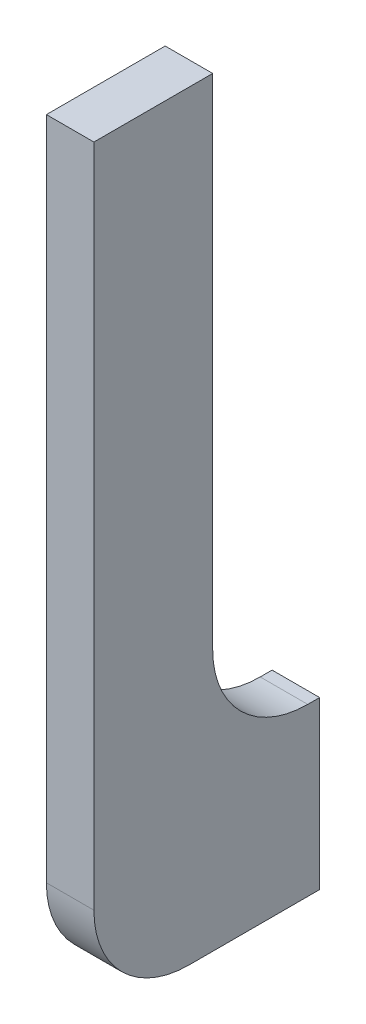
ISO-10303-21;
HEADER;
FILE_DESCRIPTION(('STEP AP214'),'2;1');
FILE_NAME('part.step','',(''),(''),'','','');
FILE_SCHEMA(('AUTOMOTIVE_DESIGN { 1 0 10303 214 1 1 1 1 }'));
ENDSEC;
DATA;
#1=APPLICATION_CONTEXT('core data for automotive mechanical design processes');
#2=APPLICATION_PROTOCOL_DEFINITION('international standard','automotive_design',2000,#1);
#3=PRODUCT_CONTEXT('',#1,'mechanical');
#4=PRODUCT('Part','Part','',(#3));
#5=PRODUCT_RELATED_PRODUCT_CATEGORY('part','',(#4));
#6=PRODUCT_DEFINITION_FORMATION('','',#4);
#7=PRODUCT_DEFINITION_CONTEXT('part definition',#1,'design');
#8=PRODUCT_DEFINITION('design','',#6,#7);
#9=PRODUCT_DEFINITION_SHAPE('','',#8);
#10=(LENGTH_UNIT() NAMED_UNIT(*) SI_UNIT(.MILLI.,.METRE.));
#11=(NAMED_UNIT(*) PLANE_ANGLE_UNIT() SI_UNIT($,.RADIAN.));
#12=(NAMED_UNIT(*) SI_UNIT($,.STERADIAN.) SOLID_ANGLE_UNIT());
#13=UNCERTAINTY_MEASURE_WITH_UNIT(LENGTH_MEASURE(1.E-05),#10,'distance_accuracy_value','');
#14=(GEOMETRIC_REPRESENTATION_CONTEXT(3) GLOBAL_UNCERTAINTY_ASSIGNED_CONTEXT((#13)) GLOBAL_UNIT_ASSIGNED_CONTEXT((#10,
#11,#12)) REPRESENTATION_CONTEXT('',''));
#15=CARTESIAN_POINT('',(0.,0.,0.));
#16=DIRECTION('',(0.,0.,1.));
#17=DIRECTION('',(1.,0.,0.));
#18=AXIS2_PLACEMENT_3D('',#15,#16,#17);
#19=CARTESIAN_POINT('',(0.,0.,0.));
#20=DIRECTION('',(0.,0.,1.));
#21=DIRECTION('',(1.,0.,0.));
#22=AXIS2_PLACEMENT_3D('',#19,#20,#21);
#23=PLANE('',#22);
#24=DIRECTION('',(0.,1.,0.));
#25=VECTOR('',#24,1.);
#26=CARTESIAN_POINT('',(2.,15.,0.));
#27=LINE('',#26,#25);
#28=CARTESIAN_POINT('',(2.00000000000001,-5.99802755198724,0.));
#29=VERTEX_POINT('',#28);
#30=CARTESIAN_POINT('',(2.,15.,0.));
#31=VERTEX_POINT('',#30);
#32=EDGE_CURVE('E148',#29,#31,#27,.T.);
#33=ORIENTED_EDGE('',*,*,#32,.F.);
#34=DIRECTION('',(1.,0.,0.));
#35=VECTOR('',#34,1.);
#36=CARTESIAN_POINT('',(0.,-5.99802755198725,0.));
#37=LINE('',#36,#35);
#38=CARTESIAN_POINT('',(0.,-5.99802755198725,0.));
#39=VERTEX_POINT('',#38);
#40=EDGE_CURVE('E63',#29,#39,#37,.F.);
#41=ORIENTED_EDGE('',*,*,#40,.T.);
#42=DIRECTION('',(0.,-1.,0.));
#43=VECTOR('',#42,1.);
#44=CARTESIAN_POINT('',(0.,0.,0.));
#45=LINE('',#44,#43);
#46=CARTESIAN_POINT('',(0.,15.,0.));
#47=VERTEX_POINT('',#46);
#48=EDGE_CURVE('E154',#47,#39,#45,.T.);
#49=ORIENTED_EDGE('',*,*,#48,.F.);
#50=DIRECTION('',(-1.,0.,0.));
#51=VECTOR('',#50,1.);
#52=CARTESIAN_POINT('',(0.,15.,0.));
#53=LINE('',#52,#51);
#54=EDGE_CURVE('E164',#31,#47,#53,.T.);
#55=ORIENTED_EDGE('',*,*,#54,.F.);
#56=EDGE_LOOP('',(#33,#41,#49,#55));
#57=FACE_BOUND('',#56,.T.);
#58=ADVANCED_FACE('F41',(#57),#23,.F.);
#59=CARTESIAN_POINT('',(0.,-17.,5.));
#60=DIRECTION('',(0.,1.,0.));
#61=DIRECTION('',(0.,0.,1.));
#62=AXIS2_PLACEMENT_3D('',#59,#60,#61);
#63=PLANE('',#62);
#64=DIRECTION('',(0.,0.,-1.));
#65=VECTOR('',#64,1.);
#66=CARTESIAN_POINT('',(2.,-17.,5.));
#67=LINE('',#66,#65);
#68=CARTESIAN_POINT('',(2.,-17.,1.));
#69=VERTEX_POINT('',#68);
#70=CARTESIAN_POINT('',(2.,-17.,-4.5));
#71=VERTEX_POINT('',#70);
#72=EDGE_CURVE('E108',#69,#71,#67,.T.);
#73=ORIENTED_EDGE('',*,*,#72,.F.);
#74=DIRECTION('',(1.,0.,0.));
#75=VECTOR('',#74,1.);
#76=CARTESIAN_POINT('',(0.,-17.,1.));
#77=LINE('',#76,#75);
#78=CARTESIAN_POINT('',(0.,-17.,1.));
#79=VERTEX_POINT('',#78);
#80=EDGE_CURVE('E183',#69,#79,#77,.F.);
#81=ORIENTED_EDGE('',*,*,#80,.T.);
#82=DIRECTION('',(0.,0.,-1.));
#83=VECTOR('',#82,1.);
#84=CARTESIAN_POINT('',(0.,-17.,5.));
#85=LINE('',#84,#83);
#86=CARTESIAN_POINT('',(0.,-17.,-4.5));
#87=VERTEX_POINT('',#86);
#88=EDGE_CURVE('E119',#79,#87,#85,.T.);
#89=ORIENTED_EDGE('',*,*,#88,.T.);
#90=DIRECTION('',(-1.,0.,0.));
#91=VECTOR('',#90,1.);
#92=CARTESIAN_POINT('',(2.,-17.,-4.5));
#93=LINE('',#92,#91);
#94=EDGE_CURVE('E123',#71,#87,#93,.T.);
#95=ORIENTED_EDGE('',*,*,#94,.F.);
#96=EDGE_LOOP('',(#73,#81,#89,#95));
#97=FACE_BOUND('',#96,.T.);
#98=ADVANCED_FACE('F124',(#97),#63,.F.);
#99=CARTESIAN_POINT('',(2.,15.,5.));
#100=DIRECTION('',(-1.,0.,0.));
#101=DIRECTION('',(0.,-1.,0.));
#102=AXIS2_PLACEMENT_3D('',#99,#100,#101);
#103=PLANE('',#102);
#104=DIRECTION('',(0.,1.,0.));
#105=VECTOR('',#104,1.);
#106=CARTESIAN_POINT('',(2.,-17.,5.));
#107=LINE('',#106,#105);
#108=CARTESIAN_POINT('',(2.,-13.,5.));
#109=VERTEX_POINT('',#108);
#110=CARTESIAN_POINT('',(2.,15.,5.));
#111=VERTEX_POINT('',#110);
#112=EDGE_CURVE('E153',#109,#111,#107,.T.);
#113=ORIENTED_EDGE('',*,*,#112,.F.);
#114=CARTESIAN_POINT('',(2.00000000000001,-13.,1.));
#115=DIRECTION('',(-1.,0.,0.));
#116=DIRECTION('',(0.,-1.,0.));
#117=AXIS2_PLACEMENT_3D('',#114,#115,#116);
#118=CIRCLE('',#117,4.);
#119=EDGE_CURVE('E115',#109,#69,#118,.F.);
#120=ORIENTED_EDGE('',*,*,#119,.T.);
#121=ORIENTED_EDGE('',*,*,#72,.T.);
#122=DIRECTION('',(0.,-1.,0.));
#123=VECTOR('',#122,1.);
#124=CARTESIAN_POINT('',(2.,-9.99802755198725,-4.5));
#125=LINE('',#124,#123);
#126=CARTESIAN_POINT('',(2.,-9.99802755198725,-4.5));
#127=VERTEX_POINT('',#126);
#128=EDGE_CURVE('E114',#127,#71,#125,.T.);
#129=ORIENTED_EDGE('',*,*,#128,.F.);
#130=DIRECTION('',(0.,0.,1.));
#131=VECTOR('',#130,1.);
#132=CARTESIAN_POINT('',(2.,-9.99802755198725,-4.5));
#133=LINE('',#132,#131);
#134=CARTESIAN_POINT('',(2.,-9.99802755198725,-4.));
#135=VERTEX_POINT('',#134);
#136=EDGE_CURVE('E142',#127,#135,#133,.T.);
#137=ORIENTED_EDGE('',*,*,#136,.T.);
#138=CARTESIAN_POINT('',(2.00000000000001,-5.99802755198725,-4.));
#139=DIRECTION('',(-1.,0.,0.));
#140=DIRECTION('',(0.,-1.,0.));
#141=AXIS2_PLACEMENT_3D('',#138,#139,#140);
#142=CIRCLE('',#141,4.);
#143=EDGE_CURVE('E50',#135,#29,#142,.T.);
#144=ORIENTED_EDGE('',*,*,#143,.T.);
#145=ORIENTED_EDGE('',*,*,#32,.T.);
#146=DIRECTION('',(0.,0.,-1.));
#147=VECTOR('',#146,1.);
#148=CARTESIAN_POINT('',(2.,15.,5.));
#149=LINE('',#148,#147);
#150=EDGE_CURVE('E120',#111,#31,#149,.T.);
#151=ORIENTED_EDGE('',*,*,#150,.F.);
#152=EDGE_LOOP('',(#113,#120,#121,#129,#137,#144,#145,#151));
#153=FACE_BOUND('',#152,.T.);
#154=ADVANCED_FACE('F111',(#153),#103,.F.);
#155=CARTESIAN_POINT('',(0.,15.,5.));
#156=DIRECTION('',(0.,-1.,0.));
#157=DIRECTION('',(0.,0.,-1.));
#158=AXIS2_PLACEMENT_3D('',#155,#156,#157);
#159=PLANE('',#158);
#160=ORIENTED_EDGE('',*,*,#54,.T.);
#161=DIRECTION('',(0.,0.,-1.));
#162=VECTOR('',#161,1.);
#163=CARTESIAN_POINT('',(0.,15.,5.));
#164=LINE('',#163,#162);
#165=CARTESIAN_POINT('',(0.,15.,5.));
#166=VERTEX_POINT('',#165);
#167=EDGE_CURVE('E161',#166,#47,#164,.T.);
#168=ORIENTED_EDGE('',*,*,#167,.F.);
#169=DIRECTION('',(-1.,0.,0.));
#170=VECTOR('',#169,1.);
#171=CARTESIAN_POINT('',(0.,15.,5.));
#172=LINE('',#171,#170);
#173=EDGE_CURVE('E157',#111,#166,#172,.T.);
#174=ORIENTED_EDGE('',*,*,#173,.F.);
#175=ORIENTED_EDGE('',*,*,#150,.T.);
#176=EDGE_LOOP('',(#160,#168,#174,#175));
#177=FACE_BOUND('',#176,.T.);
#178=ADVANCED_FACE('F211',(#177),#159,.F.);
#179=CARTESIAN_POINT('',(0.,0.,5.));
#180=DIRECTION('',(1.,0.,0.));
#181=DIRECTION('',(0.,0.,-1.));
#182=AXIS2_PLACEMENT_3D('',#179,#180,#181);
#183=PLANE('',#182);
#184=ORIENTED_EDGE('',*,*,#88,.F.);
#185=CARTESIAN_POINT('',(0.,-13.,1.));
#186=DIRECTION('',(1.,0.,0.));
#187=DIRECTION('',(0.,0.,-1.));
#188=AXIS2_PLACEMENT_3D('',#185,#186,#187);
#189=CIRCLE('',#188,4.);
#190=CARTESIAN_POINT('',(0.,-13.,5.));
#191=VERTEX_POINT('',#190);
#192=EDGE_CURVE('E186',#79,#191,#189,.F.);
#193=ORIENTED_EDGE('',*,*,#192,.T.);
#194=DIRECTION('',(0.,-1.,0.));
#195=VECTOR('',#194,1.);
#196=CARTESIAN_POINT('',(0.,0.,5.));
#197=LINE('',#196,#195);
#198=EDGE_CURVE('E149',#166,#191,#197,.T.);
#199=ORIENTED_EDGE('',*,*,#198,.F.);
#200=ORIENTED_EDGE('',*,*,#167,.T.);
#201=ORIENTED_EDGE('',*,*,#48,.T.);
#202=CARTESIAN_POINT('',(0.,-5.99802755198725,-4.));
#203=DIRECTION('',(1.,0.,0.));
#204=DIRECTION('',(0.,0.,-1.));
#205=AXIS2_PLACEMENT_3D('',#202,#203,#204);
#206=CIRCLE('',#205,4.);
#207=CARTESIAN_POINT('',(0.,-9.99802755198725,-4.));
#208=VERTEX_POINT('',#207);
#209=EDGE_CURVE('E11',#39,#208,#206,.T.);
#210=ORIENTED_EDGE('',*,*,#209,.T.);
#211=DIRECTION('',(0.,0.,1.));
#212=VECTOR('',#211,1.);
#213=CARTESIAN_POINT('',(0.,-9.99802755198725,-4.5));
#214=LINE('',#213,#212);
#215=CARTESIAN_POINT('',(0.,-9.99802755198725,-4.5));
#216=VERTEX_POINT('',#215);
#217=EDGE_CURVE('E145',#216,#208,#214,.T.);
#218=ORIENTED_EDGE('',*,*,#217,.F.);
#219=DIRECTION('',(0.,1.,0.));
#220=VECTOR('',#219,1.);
#221=CARTESIAN_POINT('',(0.,-17.,-4.5));
#222=LINE('',#221,#220);
#223=EDGE_CURVE('E129',#87,#216,#222,.T.);
#224=ORIENTED_EDGE('',*,*,#223,.F.);
#225=EDGE_LOOP('',(#184,#193,#199,#200,#201,#210,#218,#224));
#226=FACE_BOUND('',#225,.T.);
#227=ADVANCED_FACE('F201',(#226),#183,.F.);
#228=CARTESIAN_POINT('',(0.,0.,5.));
#229=DIRECTION('',(0.,0.,1.));
#230=DIRECTION('',(1.,0.,0.));
#231=AXIS2_PLACEMENT_3D('',#228,#229,#230);
#232=PLANE('',#231);
#233=ORIENTED_EDGE('',*,*,#198,.T.);
#234=DIRECTION('',(1.,0.,0.));
#235=VECTOR('',#234,1.);
#236=CARTESIAN_POINT('',(2.,-13.,5.));
#237=LINE('',#236,#235);
#238=EDGE_CURVE('E177',#191,#109,#237,.T.);
#239=ORIENTED_EDGE('',*,*,#238,.T.);
#240=ORIENTED_EDGE('',*,*,#112,.T.);
#241=ORIENTED_EDGE('',*,*,#173,.T.);
#242=EDGE_LOOP('',(#233,#239,#240,#241));
#243=FACE_BOUND('',#242,.T.);
#244=ADVANCED_FACE('F207',(#243),#232,.T.);
#245=CARTESIAN_POINT('',(0.,-9.99802755198725,-4.5));
#246=DIRECTION('',(0.,-1.,0.));
#247=DIRECTION('',(0.,0.,-1.));
#248=AXIS2_PLACEMENT_3D('',#245,#246,#247);
#249=PLANE('',#248);
#250=ORIENTED_EDGE('',*,*,#217,.T.);
#251=DIRECTION('',(1.,0.,0.));
#252=VECTOR('',#251,1.);
#253=CARTESIAN_POINT('',(2.,-9.99802755198725,-4.));
#254=LINE('',#253,#252);
#255=EDGE_CURVE('E189',#208,#135,#254,.T.);
#256=ORIENTED_EDGE('',*,*,#255,.T.);
#257=ORIENTED_EDGE('',*,*,#136,.F.);
#258=DIRECTION('',(1.,0.,0.));
#259=VECTOR('',#258,1.);
#260=CARTESIAN_POINT('',(0.,-9.99802755198725,-4.5));
#261=LINE('',#260,#259);
#262=EDGE_CURVE('E133',#216,#127,#261,.T.);
#263=ORIENTED_EDGE('',*,*,#262,.F.);
#264=EDGE_LOOP('',(#250,#256,#257,#263));
#265=FACE_BOUND('',#264,.T.);
#266=ADVANCED_FACE('F200',(#265),#249,.F.);
#267=CARTESIAN_POINT('',(0.,0.,-4.5));
#268=DIRECTION('',(0.,0.,-1.));
#269=DIRECTION('',(-1.,0.,0.));
#270=AXIS2_PLACEMENT_3D('',#267,#268,#269);
#271=PLANE('',#270);
#272=ORIENTED_EDGE('',*,*,#128,.T.);
#273=ORIENTED_EDGE('',*,*,#94,.T.);
#274=ORIENTED_EDGE('',*,*,#223,.T.);
#275=ORIENTED_EDGE('',*,*,#262,.T.);
#276=EDGE_LOOP('',(#272,#273,#274,#275));
#277=FACE_BOUND('',#276,.T.);
#278=ADVANCED_FACE('F131',(#277),#271,.T.);
#279=CARTESIAN_POINT('',(0.,-13.,1.));
#280=DIRECTION('',(-1.,0.,0.));
#281=DIRECTION('',(0.,0.,1.));
#282=AXIS2_PLACEMENT_3D('',#279,#280,#281);
#283=CYLINDRICAL_SURFACE('',#282,4.);
#284=ORIENTED_EDGE('',*,*,#192,.F.);
#285=ORIENTED_EDGE('',*,*,#80,.F.);
#286=ORIENTED_EDGE('',*,*,#119,.F.);
#287=ORIENTED_EDGE('',*,*,#238,.F.);
#288=EDGE_LOOP('',(#284,#285,#286,#287));
#289=FACE_BOUND('',#288,.T.);
#290=ADVANCED_FACE('F205',(#289),#283,.T.);
#291=CARTESIAN_POINT('',(0.,-5.99802755198725,-4.));
#292=DIRECTION('',(-1.,0.,0.));
#293=DIRECTION('',(0.,0.,1.));
#294=AXIS2_PLACEMENT_3D('',#291,#292,#293);
#295=CYLINDRICAL_SURFACE('',#294,4.);
#296=ORIENTED_EDGE('',*,*,#209,.F.);
#297=ORIENTED_EDGE('',*,*,#40,.F.);
#298=ORIENTED_EDGE('',*,*,#143,.F.);
#299=ORIENTED_EDGE('',*,*,#255,.F.);
#300=EDGE_LOOP('',(#296,#297,#298,#299));
#301=FACE_BOUND('',#300,.T.);
#302=ADVANCED_FACE('F43',(#301),#295,.F.);
#303=CLOSED_SHELL('',(#58,#98,#154,#178,#227,#244,#266,#278,#290,#302));
#304=MANIFOLD_SOLID_BREP('B2',#303);
#305=ADVANCED_BREP_SHAPE_REPRESENTATION('',(#18,#304),#14);
#306=SHAPE_DEFINITION_REPRESENTATION(#9,#305);
ENDSEC;
END-ISO-10303-21;
